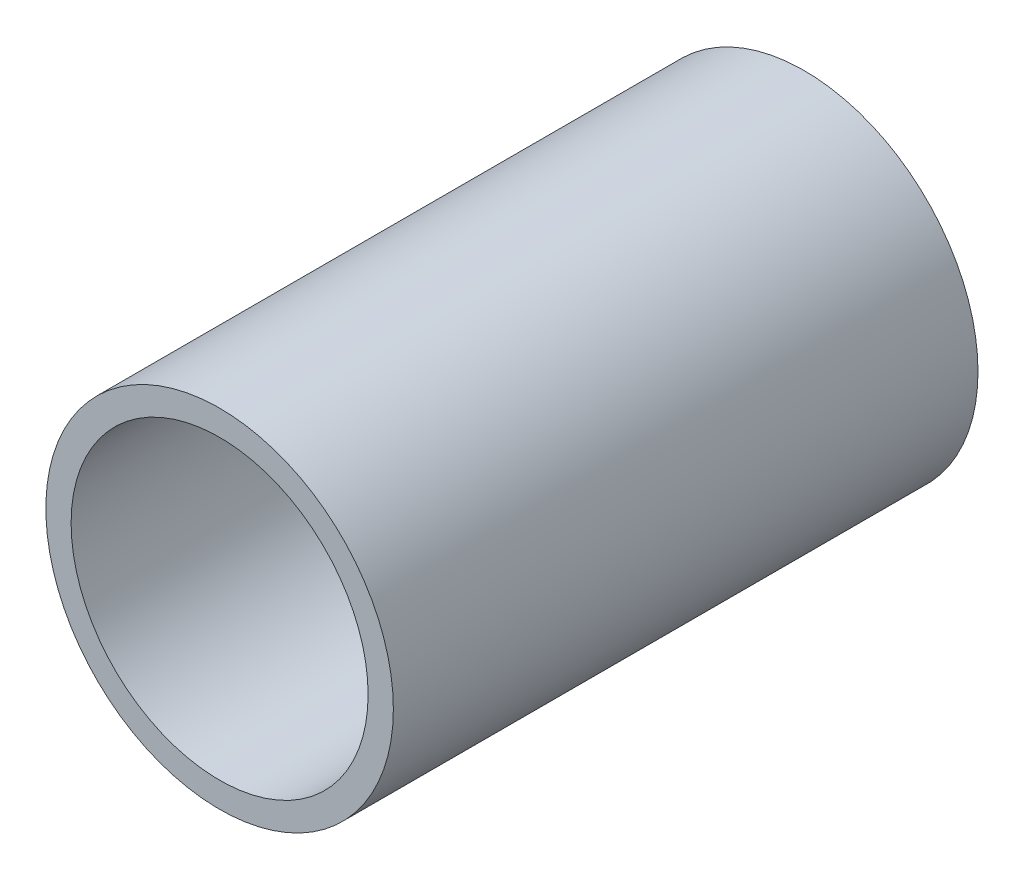
ISO-10303-21;
HEADER;
FILE_DESCRIPTION(('STEP AP214'),'2;1');
FILE_NAME('part.step','',(''),(''),'','','');
FILE_SCHEMA(('AUTOMOTIVE_DESIGN { 1 0 10303 214 1 1 1 1 }'));
ENDSEC;
DATA;
#1=APPLICATION_CONTEXT('core data for automotive mechanical design processes');
#2=APPLICATION_PROTOCOL_DEFINITION('international standard','automotive_design',2000,#1);
#3=PRODUCT_CONTEXT('',#1,'mechanical');
#4=PRODUCT('Part','Part','',(#3));
#5=PRODUCT_RELATED_PRODUCT_CATEGORY('part','',(#4));
#6=PRODUCT_DEFINITION_FORMATION('','',#4);
#7=PRODUCT_DEFINITION_CONTEXT('part definition',#1,'design');
#8=PRODUCT_DEFINITION('design','',#6,#7);
#9=PRODUCT_DEFINITION_SHAPE('','',#8);
#10=(LENGTH_UNIT() NAMED_UNIT(*) SI_UNIT(.MILLI.,.METRE.));
#11=(NAMED_UNIT(*) PLANE_ANGLE_UNIT() SI_UNIT($,.RADIAN.));
#12=(NAMED_UNIT(*) SI_UNIT($,.STERADIAN.) SOLID_ANGLE_UNIT());
#13=UNCERTAINTY_MEASURE_WITH_UNIT(LENGTH_MEASURE(1.E-05),#10,'distance_accuracy_value','');
#14=(GEOMETRIC_REPRESENTATION_CONTEXT(3) GLOBAL_UNCERTAINTY_ASSIGNED_CONTEXT((#13)) GLOBAL_UNIT_ASSIGNED_CONTEXT((#10,
#11,#12)) REPRESENTATION_CONTEXT('',''));
#15=CARTESIAN_POINT('',(0.,0.,0.));
#16=DIRECTION('',(0.,0.,1.));
#17=DIRECTION('',(1.,0.,0.));
#18=AXIS2_PLACEMENT_3D('',#15,#16,#17);
#19=CARTESIAN_POINT('',(0.,0.,100.));
#20=DIRECTION('',(0.,0.,1.));
#21=DIRECTION('',(1.,0.,0.));
#22=AXIS2_PLACEMENT_3D('',#19,#20,#21);
#23=PLANE('',#22);
#24=CARTESIAN_POINT('',(0.,0.,100.));
#25=DIRECTION('',(0.,0.,1.));
#26=DIRECTION('',(1.,0.,0.));
#27=AXIS2_PLACEMENT_3D('',#24,#25,#26);
#28=CIRCLE('',#27,29.72);
#29=CARTESIAN_POINT('',(29.72,0.,100.));
#30=VERTEX_POINT('',#29);
#31=EDGE_CURVE('E10',#30,#30,#28,.T.);
#32=ORIENTED_EDGE('',*,*,#31,.T.);
#33=EDGE_LOOP('',(#32));
#34=FACE_BOUND('',#33,.T.);
#35=CARTESIAN_POINT('',(0.,0.,100.));
#36=DIRECTION('',(0.,0.,1.));
#37=DIRECTION('',(1.,0.,0.));
#38=AXIS2_PLACEMENT_3D('',#35,#36,#37);
#39=CIRCLE('',#38,25.4);
#40=CARTESIAN_POINT('',(25.4,0.,100.));
#41=VERTEX_POINT('',#40);
#42=EDGE_CURVE('E48',#41,#41,#39,.T.);
#43=ORIENTED_EDGE('',*,*,#42,.F.);
#44=EDGE_LOOP('',(#43));
#45=FACE_BOUND('',#44,.T.);
#46=ADVANCED_FACE('F37',(#34,#45),#23,.T.);
#47=CARTESIAN_POINT('',(0.,0.,0.));
#48=DIRECTION('',(0.,0.,1.));
#49=DIRECTION('',(1.,0.,0.));
#50=AXIS2_PLACEMENT_3D('',#47,#48,#49);
#51=PLANE('',#50);
#52=CARTESIAN_POINT('',(0.,0.,0.));
#53=DIRECTION('',(0.,0.,1.));
#54=DIRECTION('',(1.,0.,0.));
#55=AXIS2_PLACEMENT_3D('',#52,#53,#54);
#56=CIRCLE('',#55,29.72);
#57=CARTESIAN_POINT('',(29.72,0.,0.));
#58=VERTEX_POINT('',#57);
#59=EDGE_CURVE('E41',#58,#58,#56,.T.);
#60=ORIENTED_EDGE('',*,*,#59,.F.);
#61=EDGE_LOOP('',(#60));
#62=FACE_BOUND('',#61,.T.);
#63=CARTESIAN_POINT('',(0.,0.,0.));
#64=DIRECTION('',(0.,0.,1.));
#65=DIRECTION('',(1.,0.,0.));
#66=AXIS2_PLACEMENT_3D('',#63,#64,#65);
#67=CIRCLE('',#66,25.4);
#68=CARTESIAN_POINT('',(25.4,0.,0.));
#69=VERTEX_POINT('',#68);
#70=EDGE_CURVE('E50',#69,#69,#67,.T.);
#71=ORIENTED_EDGE('',*,*,#70,.T.);
#72=EDGE_LOOP('',(#71));
#73=FACE_BOUND('',#72,.T.);
#74=ADVANCED_FACE('F60',(#62,#73),#51,.F.);
#75=CARTESIAN_POINT('',(0.,0.,100.));
#76=DIRECTION('',(0.,0.,-1.));
#77=DIRECTION('',(-1.,0.,0.));
#78=AXIS2_PLACEMENT_3D('',#75,#76,#77);
#79=CYLINDRICAL_SURFACE('',#78,29.72);
#80=ORIENTED_EDGE('',*,*,#31,.F.);
#81=EDGE_LOOP('',(#80));
#82=FACE_BOUND('',#81,.T.);
#83=ORIENTED_EDGE('',*,*,#59,.T.);
#84=EDGE_LOOP('',(#83));
#85=FACE_BOUND('',#84,.T.);
#86=ADVANCED_FACE('F39',(#82,#85),#79,.T.);
#87=CARTESIAN_POINT('',(0.,0.,100.));
#88=DIRECTION('',(0.,0.,-1.));
#89=DIRECTION('',(-1.,0.,0.));
#90=AXIS2_PLACEMENT_3D('',#87,#88,#89);
#91=CYLINDRICAL_SURFACE('',#90,25.4);
#92=ORIENTED_EDGE('',*,*,#42,.T.);
#93=EDGE_LOOP('',(#92));
#94=FACE_BOUND('',#93,.T.);
#95=ORIENTED_EDGE('',*,*,#70,.F.);
#96=EDGE_LOOP('',(#95));
#97=FACE_BOUND('',#96,.T.);
#98=ADVANCED_FACE('F56',(#94,#97),#91,.F.);
#99=CLOSED_SHELL('',(#46,#74,#86,#98));
#100=MANIFOLD_SOLID_BREP('B2',#99);
#101=ADVANCED_BREP_SHAPE_REPRESENTATION('',(#18,#100),#14);
#102=SHAPE_DEFINITION_REPRESENTATION(#9,#101);
ENDSEC;
END-ISO-10303-21;
